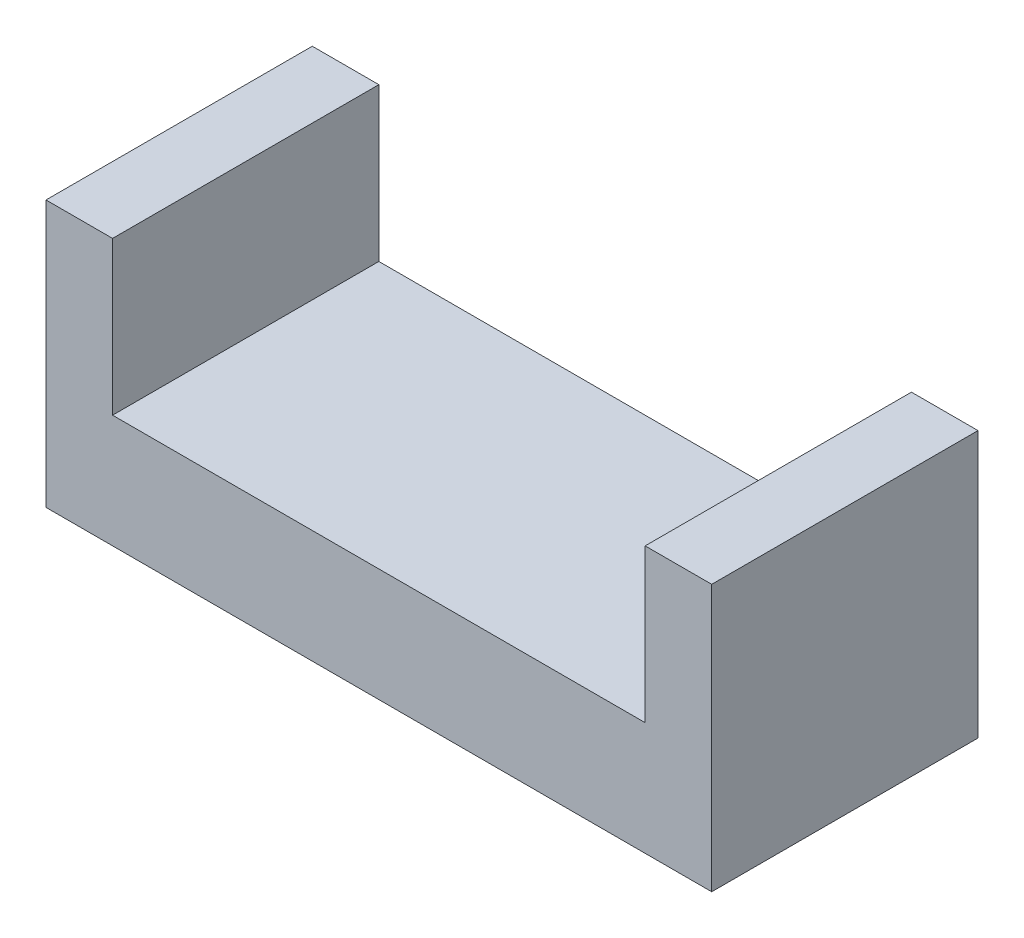
ISO-10303-21;
HEADER;
FILE_DESCRIPTION(('STEP AP214'),'2;1');
FILE_NAME('part.step','',(''),(''),'','','');
FILE_SCHEMA(('AUTOMOTIVE_DESIGN { 1 0 10303 214 1 1 1 1 }'));
ENDSEC;
DATA;
#1=APPLICATION_CONTEXT('core data for automotive mechanical design processes');
#2=APPLICATION_PROTOCOL_DEFINITION('international standard','automotive_design',2000,#1);
#3=PRODUCT_CONTEXT('',#1,'mechanical');
#4=PRODUCT('Part','Part','',(#3));
#5=PRODUCT_RELATED_PRODUCT_CATEGORY('part','',(#4));
#6=PRODUCT_DEFINITION_FORMATION('','',#4);
#7=PRODUCT_DEFINITION_CONTEXT('part definition',#1,'design');
#8=PRODUCT_DEFINITION('design','',#6,#7);
#9=PRODUCT_DEFINITION_SHAPE('','',#8);
#10=(LENGTH_UNIT() NAMED_UNIT(*) SI_UNIT(.MILLI.,.METRE.));
#11=(NAMED_UNIT(*) PLANE_ANGLE_UNIT() SI_UNIT($,.RADIAN.));
#12=(NAMED_UNIT(*) SI_UNIT($,.STERADIAN.) SOLID_ANGLE_UNIT());
#13=UNCERTAINTY_MEASURE_WITH_UNIT(LENGTH_MEASURE(1.E-05),#10,'distance_accuracy_value','');
#14=(GEOMETRIC_REPRESENTATION_CONTEXT(3) GLOBAL_UNCERTAINTY_ASSIGNED_CONTEXT((#13)) GLOBAL_UNIT_ASSIGNED_CONTEXT((#10,
#11,#12)) REPRESENTATION_CONTEXT('',''));
#15=CARTESIAN_POINT('',(0.,0.,0.));
#16=DIRECTION('',(0.,0.,1.));
#17=DIRECTION('',(1.,0.,0.));
#18=AXIS2_PLACEMENT_3D('',#15,#16,#17);
#19=CARTESIAN_POINT('',(0.,10.,20.));
#20=DIRECTION('',(0.,1.,0.));
#21=DIRECTION('',(-1.,0.,0.));
#22=AXIS2_PLACEMENT_3D('',#19,#20,#21);
#23=PLANE('',#22);
#24=DIRECTION('',(1.,0.,0.));
#25=VECTOR('',#24,1.);
#26=CARTESIAN_POINT('',(0.,10.,0.));
#27=LINE('',#26,#25);
#28=CARTESIAN_POINT('',(20.,10.,0.));
#29=VERTEX_POINT('',#28);
#30=CARTESIAN_POINT('',(25.,10.,0.));
#31=VERTEX_POINT('',#30);
#32=EDGE_CURVE('E130',#29,#31,#27,.T.);
#33=ORIENTED_EDGE('',*,*,#32,.F.);
#34=DIRECTION('',(0.,0.,-1.));
#35=VECTOR('',#34,1.);
#36=CARTESIAN_POINT('',(20.,10.,20.));
#37=LINE('',#36,#35);
#38=CARTESIAN_POINT('',(20.,10.,20.));
#39=VERTEX_POINT('',#38);
#40=EDGE_CURVE('E11',#39,#29,#37,.T.);
#41=ORIENTED_EDGE('',*,*,#40,.F.);
#42=DIRECTION('',(1.,0.,0.));
#43=VECTOR('',#42,1.);
#44=CARTESIAN_POINT('',(0.,10.,20.));
#45=LINE('',#44,#43);
#46=CARTESIAN_POINT('',(25.,10.,20.));
#47=VERTEX_POINT('',#46);
#48=EDGE_CURVE('E148',#39,#47,#45,.T.);
#49=ORIENTED_EDGE('',*,*,#48,.T.);
#50=DIRECTION('',(0.,0.,-1.));
#51=VECTOR('',#50,1.);
#52=CARTESIAN_POINT('',(25.,10.,20.));
#53=LINE('',#52,#51);
#54=EDGE_CURVE('E52',#47,#31,#53,.T.);
#55=ORIENTED_EDGE('',*,*,#54,.T.);
#56=EDGE_LOOP('',(#33,#41,#49,#55));
#57=FACE_BOUND('',#56,.T.);
#58=ADVANCED_FACE('F35',(#57),#23,.T.);
#59=CARTESIAN_POINT('',(20.,0.,20.));
#60=DIRECTION('',(1.,0.,0.));
#61=DIRECTION('',(0.,0.,-1.));
#62=AXIS2_PLACEMENT_3D('',#59,#60,#61);
#63=PLANE('',#62);
#64=DIRECTION('',(0.,-1.,0.));
#65=VECTOR('',#64,1.);
#66=CARTESIAN_POINT('',(20.,0.,0.));
#67=LINE('',#66,#65);
#68=CARTESIAN_POINT('',(20.,-1.5,0.));
#69=VERTEX_POINT('',#68);
#70=EDGE_CURVE('E132',#29,#69,#67,.T.);
#71=ORIENTED_EDGE('',*,*,#70,.T.);
#72=DIRECTION('',(0.,0.,-1.));
#73=VECTOR('',#72,1.);
#74=CARTESIAN_POINT('',(20.,-1.5,20.));
#75=LINE('',#74,#73);
#76=CARTESIAN_POINT('',(20.,-1.5,20.));
#77=VERTEX_POINT('',#76);
#78=EDGE_CURVE('E44',#77,#69,#75,.T.);
#79=ORIENTED_EDGE('',*,*,#78,.F.);
#80=DIRECTION('',(0.,-1.,0.));
#81=VECTOR('',#80,1.);
#82=CARTESIAN_POINT('',(20.,0.,20.));
#83=LINE('',#82,#81);
#84=EDGE_CURVE('E173',#39,#77,#83,.T.);
#85=ORIENTED_EDGE('',*,*,#84,.F.);
#86=ORIENTED_EDGE('',*,*,#40,.T.);
#87=EDGE_LOOP('',(#71,#79,#85,#86));
#88=FACE_BOUND('',#87,.T.);
#89=ADVANCED_FACE('F37',(#88),#63,.F.);
#90=CARTESIAN_POINT('',(0.,-1.5,20.));
#91=DIRECTION('',(0.,1.,0.));
#92=DIRECTION('',(0.,0.,1.));
#93=AXIS2_PLACEMENT_3D('',#90,#91,#92);
#94=PLANE('',#93);
#95=DIRECTION('',(1.,0.,0.));
#96=VECTOR('',#95,1.);
#97=CARTESIAN_POINT('',(0.,-1.5,0.));
#98=LINE('',#97,#96);
#99=CARTESIAN_POINT('',(-20.,-1.5,0.));
#100=VERTEX_POINT('',#99);
#101=EDGE_CURVE('E136',#100,#69,#98,.T.);
#102=ORIENTED_EDGE('',*,*,#101,.F.);
#103=DIRECTION('',(0.,0.,-1.));
#104=VECTOR('',#103,1.);
#105=CARTESIAN_POINT('',(-20.,-1.5,20.));
#106=LINE('',#105,#104);
#107=CARTESIAN_POINT('',(-20.,-1.5,20.));
#108=VERTEX_POINT('',#107);
#109=EDGE_CURVE('E154',#108,#100,#106,.T.);
#110=ORIENTED_EDGE('',*,*,#109,.F.);
#111=DIRECTION('',(1.,0.,0.));
#112=VECTOR('',#111,1.);
#113=CARTESIAN_POINT('',(0.,-1.5,20.));
#114=LINE('',#113,#112);
#115=EDGE_CURVE('E161',#108,#77,#114,.T.);
#116=ORIENTED_EDGE('',*,*,#115,.T.);
#117=ORIENTED_EDGE('',*,*,#78,.T.);
#118=EDGE_LOOP('',(#102,#110,#116,#117));
#119=FACE_BOUND('',#118,.T.);
#120=ADVANCED_FACE('F159',(#119),#94,.T.);
#121=CARTESIAN_POINT('',(-20.,0.,20.));
#122=DIRECTION('',(1.,0.,0.));
#123=DIRECTION('',(0.,0.,-1.));
#124=AXIS2_PLACEMENT_3D('',#121,#122,#123);
#125=PLANE('',#124);
#126=DIRECTION('',(0.,-1.,0.));
#127=VECTOR('',#126,1.);
#128=CARTESIAN_POINT('',(-20.,0.,0.));
#129=LINE('',#128,#127);
#130=CARTESIAN_POINT('',(-20.,10.,0.));
#131=VERTEX_POINT('',#130);
#132=EDGE_CURVE('E139',#131,#100,#129,.T.);
#133=ORIENTED_EDGE('',*,*,#132,.F.);
#134=DIRECTION('',(0.,0.,-1.));
#135=VECTOR('',#134,1.);
#136=CARTESIAN_POINT('',(-20.,10.,20.));
#137=LINE('',#136,#135);
#138=CARTESIAN_POINT('',(-20.,10.,20.));
#139=VERTEX_POINT('',#138);
#140=EDGE_CURVE('E152',#139,#131,#137,.T.);
#141=ORIENTED_EDGE('',*,*,#140,.F.);
#142=DIRECTION('',(0.,-1.,0.));
#143=VECTOR('',#142,1.);
#144=CARTESIAN_POINT('',(-20.,0.,20.));
#145=LINE('',#144,#143);
#146=EDGE_CURVE('E172',#139,#108,#145,.T.);
#147=ORIENTED_EDGE('',*,*,#146,.T.);
#148=ORIENTED_EDGE('',*,*,#109,.T.);
#149=EDGE_LOOP('',(#133,#141,#147,#148));
#150=FACE_BOUND('',#149,.T.);
#151=ADVANCED_FACE('F170',(#150),#125,.T.);
#152=CARTESIAN_POINT('',(-25.,10.,0.));
#153=VERTEX_POINT('',#152);
#154=EDGE_CURVE('E133',#153,#131,#27,.T.);
#155=ORIENTED_EDGE('',*,*,#154,.F.);
#156=DIRECTION('',(0.,0.,-1.));
#157=VECTOR('',#156,1.);
#158=CARTESIAN_POINT('',(-25.,10.,20.));
#159=LINE('',#158,#157);
#160=CARTESIAN_POINT('',(-25.,10.,20.));
#161=VERTEX_POINT('',#160);
#162=EDGE_CURVE('E122',#161,#153,#159,.T.);
#163=ORIENTED_EDGE('',*,*,#162,.F.);
#164=EDGE_CURVE('E112',#161,#139,#45,.T.);
#165=ORIENTED_EDGE('',*,*,#164,.T.);
#166=ORIENTED_EDGE('',*,*,#140,.T.);
#167=EDGE_LOOP('',(#155,#163,#165,#166));
#168=FACE_BOUND('',#167,.T.);
#169=ADVANCED_FACE('F178',(#168),#23,.T.);
#170=CARTESIAN_POINT('',(-25.,0.,20.));
#171=DIRECTION('',(1.,0.,0.));
#172=DIRECTION('',(0.,0.,-1.));
#173=AXIS2_PLACEMENT_3D('',#170,#171,#172);
#174=PLANE('',#173);
#175=DIRECTION('',(0.,-1.,0.));
#176=VECTOR('',#175,1.);
#177=CARTESIAN_POINT('',(-25.,0.,0.));
#178=LINE('',#177,#176);
#179=CARTESIAN_POINT('',(-25.,-10.,0.));
#180=VERTEX_POINT('',#179);
#181=EDGE_CURVE('E119',#153,#180,#178,.T.);
#182=ORIENTED_EDGE('',*,*,#181,.T.);
#183=DIRECTION('',(0.,0.,-1.));
#184=VECTOR('',#183,1.);
#185=CARTESIAN_POINT('',(-25.,-10.,20.));
#186=LINE('',#185,#184);
#187=CARTESIAN_POINT('',(-25.,-10.,20.));
#188=VERTEX_POINT('',#187);
#189=EDGE_CURVE('E116',#188,#180,#186,.T.);
#190=ORIENTED_EDGE('',*,*,#189,.F.);
#191=DIRECTION('',(0.,-1.,0.));
#192=VECTOR('',#191,1.);
#193=CARTESIAN_POINT('',(-25.,0.,20.));
#194=LINE('',#193,#192);
#195=EDGE_CURVE('E103',#161,#188,#194,.T.);
#196=ORIENTED_EDGE('',*,*,#195,.F.);
#197=ORIENTED_EDGE('',*,*,#162,.T.);
#198=EDGE_LOOP('',(#182,#190,#196,#197));
#199=FACE_BOUND('',#198,.T.);
#200=ADVANCED_FACE('F117',(#199),#174,.F.);
#201=CARTESIAN_POINT('',(0.,-10.,20.));
#202=DIRECTION('',(0.,1.,0.));
#203=DIRECTION('',(0.,0.,1.));
#204=AXIS2_PLACEMENT_3D('',#201,#202,#203);
#205=PLANE('',#204);
#206=DIRECTION('',(1.,0.,0.));
#207=VECTOR('',#206,1.);
#208=CARTESIAN_POINT('',(0.,-10.,0.));
#209=LINE('',#208,#207);
#210=CARTESIAN_POINT('',(25.,-10.,0.));
#211=VERTEX_POINT('',#210);
#212=EDGE_CURVE('E143',#180,#211,#209,.T.);
#213=ORIENTED_EDGE('',*,*,#212,.T.);
#214=DIRECTION('',(0.,0.,-1.));
#215=VECTOR('',#214,1.);
#216=CARTESIAN_POINT('',(25.,-10.,20.));
#217=LINE('',#216,#215);
#218=CARTESIAN_POINT('',(25.,-10.,20.));
#219=VERTEX_POINT('',#218);
#220=EDGE_CURVE('E78',#219,#211,#217,.T.);
#221=ORIENTED_EDGE('',*,*,#220,.F.);
#222=DIRECTION('',(1.,0.,0.));
#223=VECTOR('',#222,1.);
#224=CARTESIAN_POINT('',(0.,-10.,20.));
#225=LINE('',#224,#223);
#226=EDGE_CURVE('E109',#188,#219,#225,.T.);
#227=ORIENTED_EDGE('',*,*,#226,.F.);
#228=ORIENTED_EDGE('',*,*,#189,.T.);
#229=EDGE_LOOP('',(#213,#221,#227,#228));
#230=FACE_BOUND('',#229,.T.);
#231=ADVANCED_FACE('F124',(#230),#205,.F.);
#232=CARTESIAN_POINT('',(25.,0.,20.));
#233=DIRECTION('',(1.,0.,0.));
#234=DIRECTION('',(0.,0.,-1.));
#235=AXIS2_PLACEMENT_3D('',#232,#233,#234);
#236=PLANE('',#235);
#237=DIRECTION('',(0.,-1.,0.));
#238=VECTOR('',#237,1.);
#239=CARTESIAN_POINT('',(25.,0.,0.));
#240=LINE('',#239,#238);
#241=EDGE_CURVE('E145',#31,#211,#240,.T.);
#242=ORIENTED_EDGE('',*,*,#241,.F.);
#243=ORIENTED_EDGE('',*,*,#54,.F.);
#244=DIRECTION('',(0.,-1.,0.));
#245=VECTOR('',#244,1.);
#246=CARTESIAN_POINT('',(25.,0.,20.));
#247=LINE('',#246,#245);
#248=EDGE_CURVE('E125',#47,#219,#247,.T.);
#249=ORIENTED_EDGE('',*,*,#248,.T.);
#250=ORIENTED_EDGE('',*,*,#220,.T.);
#251=EDGE_LOOP('',(#242,#243,#249,#250));
#252=FACE_BOUND('',#251,.T.);
#253=ADVANCED_FACE('F179',(#252),#236,.T.);
#254=CARTESIAN_POINT('',(0.,0.,20.));
#255=DIRECTION('',(0.,0.,1.));
#256=DIRECTION('',(1.,0.,0.));
#257=AXIS2_PLACEMENT_3D('',#254,#255,#256);
#258=PLANE('',#257);
#259=ORIENTED_EDGE('',*,*,#48,.F.);
#260=ORIENTED_EDGE('',*,*,#84,.T.);
#261=ORIENTED_EDGE('',*,*,#115,.F.);
#262=ORIENTED_EDGE('',*,*,#146,.F.);
#263=ORIENTED_EDGE('',*,*,#164,.F.);
#264=ORIENTED_EDGE('',*,*,#195,.T.);
#265=ORIENTED_EDGE('',*,*,#226,.T.);
#266=ORIENTED_EDGE('',*,*,#248,.F.);
#267=EDGE_LOOP('',(#259,#260,#261,#262,#263,#264,#265,#266));
#268=FACE_BOUND('',#267,.T.);
#269=ADVANCED_FACE('F106',(#268),#258,.T.);
#270=CARTESIAN_POINT('',(0.,0.,0.));
#271=DIRECTION('',(0.,0.,1.));
#272=DIRECTION('',(1.,0.,0.));
#273=AXIS2_PLACEMENT_3D('',#270,#271,#272);
#274=PLANE('',#273);
#275=ORIENTED_EDGE('',*,*,#32,.T.);
#276=ORIENTED_EDGE('',*,*,#241,.T.);
#277=ORIENTED_EDGE('',*,*,#212,.F.);
#278=ORIENTED_EDGE('',*,*,#181,.F.);
#279=ORIENTED_EDGE('',*,*,#154,.T.);
#280=ORIENTED_EDGE('',*,*,#132,.T.);
#281=ORIENTED_EDGE('',*,*,#101,.T.);
#282=ORIENTED_EDGE('',*,*,#70,.F.);
#283=EDGE_LOOP('',(#275,#276,#277,#278,#279,#280,#281,#282));
#284=FACE_BOUND('',#283,.T.);
#285=ADVANCED_FACE('F165',(#284),#274,.F.);
#286=CLOSED_SHELL('',(#58,#89,#120,#151,#169,#200,#231,#253,#269,#285));
#287=MANIFOLD_SOLID_BREP('B2',#286);
#288=ADVANCED_BREP_SHAPE_REPRESENTATION('',(#18,#287),#14);
#289=SHAPE_DEFINITION_REPRESENTATION(#9,#288);
ENDSEC;
END-ISO-10303-21;
